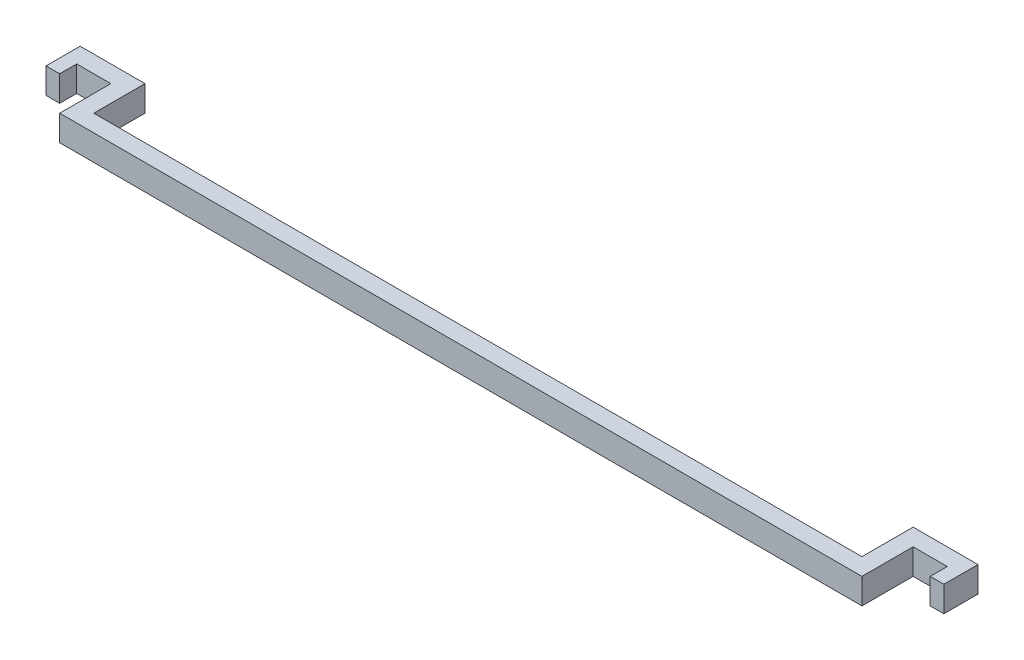
ISO-10303-21;
HEADER;
FILE_DESCRIPTION(('STEP AP214'),'2;1');
FILE_NAME('part.step','',(''),(''),'','','');
FILE_SCHEMA(('AUTOMOTIVE_DESIGN { 1 0 10303 214 1 1 1 1 }'));
ENDSEC;
DATA;
#1=APPLICATION_CONTEXT('core data for automotive mechanical design processes');
#2=APPLICATION_PROTOCOL_DEFINITION('international standard','automotive_design',2000,#1);
#3=PRODUCT_CONTEXT('',#1,'mechanical');
#4=PRODUCT('Part','Part','',(#3));
#5=PRODUCT_RELATED_PRODUCT_CATEGORY('part','',(#4));
#6=PRODUCT_DEFINITION_FORMATION('','',#4);
#7=PRODUCT_DEFINITION_CONTEXT('part definition',#1,'design');
#8=PRODUCT_DEFINITION('design','',#6,#7);
#9=PRODUCT_DEFINITION_SHAPE('','',#8);
#10=(LENGTH_UNIT() NAMED_UNIT(*) SI_UNIT(.MILLI.,.METRE.));
#11=(NAMED_UNIT(*) PLANE_ANGLE_UNIT() SI_UNIT($,.RADIAN.));
#12=(NAMED_UNIT(*) SI_UNIT($,.STERADIAN.) SOLID_ANGLE_UNIT());
#13=UNCERTAINTY_MEASURE_WITH_UNIT(LENGTH_MEASURE(1.E-05),#10,'distance_accuracy_value','');
#14=(GEOMETRIC_REPRESENTATION_CONTEXT(3) GLOBAL_UNCERTAINTY_ASSIGNED_CONTEXT((#13)) GLOBAL_UNIT_ASSIGNED_CONTEXT((#10,
#11,#12)) REPRESENTATION_CONTEXT('',''));
#15=CARTESIAN_POINT('',(0.,0.,0.));
#16=DIRECTION('',(0.,0.,1.));
#17=DIRECTION('',(1.,0.,0.));
#18=AXIS2_PLACEMENT_3D('',#15,#16,#17);
#19=CARTESIAN_POINT('',(0.,0.,0.));
#20=DIRECTION('',(0.,0.,-1.));
#21=DIRECTION('',(-1.,0.,0.));
#22=AXIS2_PLACEMENT_3D('',#19,#20,#21);
#23=PLANE('',#22);
#24=DIRECTION('',(0.,-1.,0.));
#25=VECTOR('',#24,1.);
#26=CARTESIAN_POINT('',(30.,15.0000000000001,0.));
#27=LINE('',#26,#25);
#28=CARTESIAN_POINT('',(30.,15.0000000000001,0.));
#29=VERTEX_POINT('',#28);
#30=CARTESIAN_POINT('',(30.,0.,0.));
#31=VERTEX_POINT('',#30);
#32=EDGE_CURVE('E174',#29,#31,#27,.T.);
#33=ORIENTED_EDGE('',*,*,#32,.T.);
#34=DIRECTION('',(1.,0.,0.));
#35=VECTOR('',#34,1.);
#36=CARTESIAN_POINT('',(0.,0.,0.));
#37=LINE('',#36,#35);
#38=CARTESIAN_POINT('',(-8.,0.,0.));
#39=VERTEX_POINT('',#38);
#40=EDGE_CURVE('E187',#39,#31,#37,.T.);
#41=ORIENTED_EDGE('',*,*,#40,.F.);
#42=DIRECTION('',(0.,-1.,0.));
#43=VECTOR('',#42,1.);
#44=CARTESIAN_POINT('',(-8.,15.,0.));
#45=LINE('',#44,#43);
#46=CARTESIAN_POINT('',(-8.,15.,0.));
#47=VERTEX_POINT('',#46);
#48=EDGE_CURVE('E185',#47,#39,#45,.T.);
#49=ORIENTED_EDGE('',*,*,#48,.F.);
#50=DIRECTION('',(-1.,0.,0.));
#51=VECTOR('',#50,1.);
#52=CARTESIAN_POINT('',(0.,15.,0.));
#53=LINE('',#52,#51);
#54=EDGE_CURVE('E164',#29,#47,#53,.T.);
#55=ORIENTED_EDGE('',*,*,#54,.F.);
#56=EDGE_LOOP('',(#33,#41,#49,#55));
#57=FACE_BOUND('',#56,.T.);
#58=ADVANCED_FACE('F47',(#57),#23,.T.);
#59=CARTESIAN_POINT('',(0.,0.,10.));
#60=DIRECTION('',(0.,0.,-1.));
#61=DIRECTION('',(-1.,0.,0.));
#62=AXIS2_PLACEMENT_3D('',#59,#60,#61);
#63=PLANE('',#62);
#64=DIRECTION('',(0.,-1.,0.));
#65=VECTOR('',#64,1.);
#66=CARTESIAN_POINT('',(490.,485.956473572665,10.));
#67=LINE('',#66,#65);
#68=CARTESIAN_POINT('',(490.,15.,10.));
#69=VERTEX_POINT('',#68);
#70=CARTESIAN_POINT('',(490.,0.,10.));
#71=VERTEX_POINT('',#70);
#72=EDGE_CURVE('E68',#69,#71,#67,.T.);
#73=ORIENTED_EDGE('',*,*,#72,.T.);
#74=DIRECTION('',(1.,0.,0.));
#75=VECTOR('',#74,1.);
#76=CARTESIAN_POINT('',(0.,0.,10.));
#77=LINE('',#76,#75);
#78=CARTESIAN_POINT('',(510.,0.,10.));
#79=VERTEX_POINT('',#78);
#80=EDGE_CURVE('E204',#71,#79,#77,.T.);
#81=ORIENTED_EDGE('',*,*,#80,.T.);
#82=DIRECTION('',(0.,1.,0.));
#83=VECTOR('',#82,1.);
#84=CARTESIAN_POINT('',(510.,0.,10.));
#85=LINE('',#84,#83);
#86=CARTESIAN_POINT('',(510.,15.,10.));
#87=VERTEX_POINT('',#86);
#88=EDGE_CURVE('E198',#79,#87,#85,.T.);
#89=ORIENTED_EDGE('',*,*,#88,.T.);
#90=DIRECTION('',(-1.,0.,0.));
#91=VECTOR('',#90,1.);
#92=CARTESIAN_POINT('',(0.,15.,10.));
#93=LINE('',#92,#91);
#94=EDGE_CURVE('E11',#87,#69,#93,.T.);
#95=ORIENTED_EDGE('',*,*,#94,.T.);
#96=EDGE_LOOP('',(#73,#81,#89,#95));
#97=FACE_BOUND('',#96,.T.);
#98=ADVANCED_FACE('F347',(#97),#63,.F.);
#99=CARTESIAN_POINT('',(0.,0.,10.));
#100=DIRECTION('',(0.,1.,0.));
#101=DIRECTION('',(0.,0.,1.));
#102=AXIS2_PLACEMENT_3D('',#99,#100,#101);
#103=PLANE('',#102);
#104=ORIENTED_EDGE('',*,*,#40,.T.);
#105=DIRECTION('',(0.,0.,1.));
#106=VECTOR('',#105,1.);
#107=CARTESIAN_POINT('',(30.,0.,0.));
#108=LINE('',#107,#106);
#109=CARTESIAN_POINT('',(30.,0.,30.));
#110=VERTEX_POINT('',#109);
#111=EDGE_CURVE('E177',#31,#110,#108,.T.);
#112=ORIENTED_EDGE('',*,*,#111,.T.);
#113=DIRECTION('',(1.,0.,0.));
#114=VECTOR('',#113,1.);
#115=CARTESIAN_POINT('',(0.,0.,30.));
#116=LINE('',#115,#114);
#117=CARTESIAN_POINT('',(480.,0.,30.));
#118=VERTEX_POINT('',#117);
#119=EDGE_CURVE('E297',#110,#118,#116,.T.);
#120=ORIENTED_EDGE('',*,*,#119,.T.);
#121=DIRECTION('',(0.,0.,-1.));
#122=VECTOR('',#121,1.);
#123=CARTESIAN_POINT('',(480.,0.,0.));
#124=LINE('',#123,#122);
#125=CARTESIAN_POINT('',(480.,0.,0.));
#126=VERTEX_POINT('',#125);
#127=EDGE_CURVE('E294',#118,#126,#124,.T.);
#128=ORIENTED_EDGE('',*,*,#127,.T.);
#129=CARTESIAN_POINT('',(518.,0.,0.));
#130=VERTEX_POINT('',#129);
#131=EDGE_CURVE('E192',#126,#130,#37,.T.);
#132=ORIENTED_EDGE('',*,*,#131,.T.);
#133=DIRECTION('',(0.,0.,1.));
#134=VECTOR('',#133,1.);
#135=CARTESIAN_POINT('',(518.,0.,0.));
#136=LINE('',#135,#134);
#137=CARTESIAN_POINT('',(518.,0.,20.));
#138=VERTEX_POINT('',#137);
#139=EDGE_CURVE('E211',#130,#138,#136,.T.);
#140=ORIENTED_EDGE('',*,*,#139,.T.);
#141=DIRECTION('',(1.,0.,0.));
#142=VECTOR('',#141,1.);
#143=CARTESIAN_POINT('',(510.,0.,20.));
#144=LINE('',#143,#142);
#145=CARTESIAN_POINT('',(510.,0.,20.));
#146=VERTEX_POINT('',#145);
#147=EDGE_CURVE('E231',#146,#138,#144,.T.);
#148=ORIENTED_EDGE('',*,*,#147,.F.);
#149=DIRECTION('',(0.,0.,1.));
#150=VECTOR('',#149,1.);
#151=CARTESIAN_POINT('',(510.,0.,0.));
#152=LINE('',#151,#150);
#153=EDGE_CURVE('E208',#79,#146,#152,.T.);
#154=ORIENTED_EDGE('',*,*,#153,.F.);
#155=ORIENTED_EDGE('',*,*,#80,.F.);
#156=DIRECTION('',(0.,0.,-1.));
#157=VECTOR('',#156,1.);
#158=CARTESIAN_POINT('',(490.,0.,0.));
#159=LINE('',#158,#157);
#160=CARTESIAN_POINT('',(490.,0.,40.0000000000001));
#161=VERTEX_POINT('',#160);
#162=EDGE_CURVE('E277',#161,#71,#159,.T.);
#163=ORIENTED_EDGE('',*,*,#162,.F.);
#164=DIRECTION('',(-1.,0.,0.));
#165=VECTOR('',#164,1.);
#166=CARTESIAN_POINT('',(0.,0.,40.));
#167=LINE('',#166,#165);
#168=CARTESIAN_POINT('',(20.,0.,40.));
#169=VERTEX_POINT('',#168);
#170=EDGE_CURVE('E307',#161,#169,#167,.T.);
#171=ORIENTED_EDGE('',*,*,#170,.T.);
#172=DIRECTION('',(0.,0.,-1.));
#173=VECTOR('',#172,1.);
#174=CARTESIAN_POINT('',(20.,0.,0.));
#175=LINE('',#174,#173);
#176=CARTESIAN_POINT('',(20.,0.,10.));
#177=VERTEX_POINT('',#176);
#178=EDGE_CURVE('E303',#169,#177,#175,.T.);
#179=ORIENTED_EDGE('',*,*,#178,.T.);
#180=CARTESIAN_POINT('',(0.,0.,10.));
#181=VERTEX_POINT('',#180);
#182=EDGE_CURVE('E201',#181,#177,#77,.T.);
#183=ORIENTED_EDGE('',*,*,#182,.F.);
#184=DIRECTION('',(0.,0.,1.));
#185=VECTOR('',#184,1.);
#186=CARTESIAN_POINT('',(0.,0.,0.));
#187=LINE('',#186,#185);
#188=CARTESIAN_POINT('',(0.,0.,20.));
#189=VERTEX_POINT('',#188);
#190=EDGE_CURVE('E258',#181,#189,#187,.T.);
#191=ORIENTED_EDGE('',*,*,#190,.T.);
#192=DIRECTION('',(1.,0.,0.));
#193=VECTOR('',#192,1.);
#194=CARTESIAN_POINT('',(0.,0.,20.));
#195=LINE('',#194,#193);
#196=CARTESIAN_POINT('',(-8.,0.,20.));
#197=VERTEX_POINT('',#196);
#198=EDGE_CURVE('E251',#197,#189,#195,.T.);
#199=ORIENTED_EDGE('',*,*,#198,.F.);
#200=DIRECTION('',(0.,0.,1.));
#201=VECTOR('',#200,1.);
#202=CARTESIAN_POINT('',(-8.,0.,0.));
#203=LINE('',#202,#201);
#204=EDGE_CURVE('E261',#39,#197,#203,.T.);
#205=ORIENTED_EDGE('',*,*,#204,.F.);
#206=EDGE_LOOP('',(#104,#112,#120,#128,#132,#140,#148,#154,#155,#163,#171,#179,#183,#191,#199,#205));
#207=FACE_BOUND('',#206,.T.);
#208=ADVANCED_FACE('F49',(#207),#103,.F.);
#209=CARTESIAN_POINT('',(0.,15.,10.));
#210=DIRECTION('',(0.,-1.,0.));
#211=DIRECTION('',(0.,0.,-1.));
#212=AXIS2_PLACEMENT_3D('',#209,#210,#211);
#213=PLANE('',#212);
#214=DIRECTION('',(0.,0.,-1.));
#215=VECTOR('',#214,1.);
#216=CARTESIAN_POINT('',(30.,15.,0.));
#217=LINE('',#216,#215);
#218=CARTESIAN_POINT('',(30.,15.,30.));
#219=VERTEX_POINT('',#218);
#220=EDGE_CURVE('E160',#219,#29,#217,.T.);
#221=ORIENTED_EDGE('',*,*,#220,.T.);
#222=ORIENTED_EDGE('',*,*,#54,.T.);
#223=DIRECTION('',(0.,0.,1.));
#224=VECTOR('',#223,1.);
#225=CARTESIAN_POINT('',(-8.,15.,0.));
#226=LINE('',#225,#224);
#227=CARTESIAN_POINT('',(-8.,15.,20.));
#228=VERTEX_POINT('',#227);
#229=EDGE_CURVE('E265',#47,#228,#226,.T.);
#230=ORIENTED_EDGE('',*,*,#229,.T.);
#231=DIRECTION('',(-1.,0.,0.));
#232=VECTOR('',#231,1.);
#233=CARTESIAN_POINT('',(0.,15.,20.));
#234=LINE('',#233,#232);
#235=CARTESIAN_POINT('',(0.,15.,20.));
#236=VERTEX_POINT('',#235);
#237=EDGE_CURVE('E243',#236,#228,#234,.T.);
#238=ORIENTED_EDGE('',*,*,#237,.F.);
#239=DIRECTION('',(0.,0.,1.));
#240=VECTOR('',#239,1.);
#241=CARTESIAN_POINT('',(0.,15.,0.));
#242=LINE('',#241,#240);
#243=CARTESIAN_POINT('',(0.,15.,10.));
#244=VERTEX_POINT('',#243);
#245=EDGE_CURVE('E257',#244,#236,#242,.T.);
#246=ORIENTED_EDGE('',*,*,#245,.F.);
#247=CARTESIAN_POINT('',(20.,15.0000000000001,10.));
#248=VERTEX_POINT('',#247);
#249=EDGE_CURVE('E57',#248,#244,#93,.T.);
#250=ORIENTED_EDGE('',*,*,#249,.F.);
#251=DIRECTION('',(0.,0.,1.));
#252=VECTOR('',#251,1.);
#253=CARTESIAN_POINT('',(20.,15.,0.));
#254=LINE('',#253,#252);
#255=CARTESIAN_POINT('',(20.,15.,40.));
#256=VERTEX_POINT('',#255);
#257=EDGE_CURVE('E262',#248,#256,#254,.T.);
#258=ORIENTED_EDGE('',*,*,#257,.T.);
#259=DIRECTION('',(1.,0.,0.));
#260=VECTOR('',#259,1.);
#261=CARTESIAN_POINT('',(0.,15.,40.));
#262=LINE('',#261,#260);
#263=CARTESIAN_POINT('',(490.,15.,40.0000000000001));
#264=VERTEX_POINT('',#263);
#265=EDGE_CURVE('E272',#256,#264,#262,.T.);
#266=ORIENTED_EDGE('',*,*,#265,.T.);
#267=DIRECTION('',(0.,0.,1.));
#268=VECTOR('',#267,1.);
#269=CARTESIAN_POINT('',(490.,15.,0.));
#270=LINE('',#269,#268);
#271=EDGE_CURVE('E313',#69,#264,#270,.T.);
#272=ORIENTED_EDGE('',*,*,#271,.F.);
#273=ORIENTED_EDGE('',*,*,#94,.F.);
#274=DIRECTION('',(0.,0.,1.));
#275=VECTOR('',#274,1.);
#276=CARTESIAN_POINT('',(510.,15.,0.));
#277=LINE('',#276,#275);
#278=CARTESIAN_POINT('',(510.,15.,20.));
#279=VERTEX_POINT('',#278);
#280=EDGE_CURVE('E196',#87,#279,#277,.T.);
#281=ORIENTED_EDGE('',*,*,#280,.T.);
#282=DIRECTION('',(-1.,0.,0.));
#283=VECTOR('',#282,1.);
#284=CARTESIAN_POINT('',(510.,15.,20.));
#285=LINE('',#284,#283);
#286=CARTESIAN_POINT('',(518.,15.,20.));
#287=VERTEX_POINT('',#286);
#288=EDGE_CURVE('E223',#287,#279,#285,.T.);
#289=ORIENTED_EDGE('',*,*,#288,.F.);
#290=DIRECTION('',(0.,0.,1.));
#291=VECTOR('',#290,1.);
#292=CARTESIAN_POINT('',(518.,15.,0.));
#293=LINE('',#292,#291);
#294=CARTESIAN_POINT('',(518.,15.,0.));
#295=VERTEX_POINT('',#294);
#296=EDGE_CURVE('E215',#295,#287,#293,.T.);
#297=ORIENTED_EDGE('',*,*,#296,.F.);
#298=CARTESIAN_POINT('',(480.,15.0000000000001,0.));
#299=VERTEX_POINT('',#298);
#300=EDGE_CURVE('E51',#295,#299,#53,.T.);
#301=ORIENTED_EDGE('',*,*,#300,.T.);
#302=DIRECTION('',(0.,0.,1.));
#303=VECTOR('',#302,1.);
#304=CARTESIAN_POINT('',(480.,15.,0.));
#305=LINE('',#304,#303);
#306=CARTESIAN_POINT('',(480.,15.,30.));
#307=VERTEX_POINT('',#306);
#308=EDGE_CURVE('E317',#299,#307,#305,.T.);
#309=ORIENTED_EDGE('',*,*,#308,.T.);
#310=DIRECTION('',(-1.,0.,0.));
#311=VECTOR('',#310,1.);
#312=CARTESIAN_POINT('',(0.,15.,30.));
#313=LINE('',#312,#311);
#314=EDGE_CURVE('E167',#307,#219,#313,.T.);
#315=ORIENTED_EDGE('',*,*,#314,.T.);
#316=EDGE_LOOP('',(#221,#222,#230,#238,#246,#250,#258,#266,#272,#273,#281,#289,#297,#301,#309,#315));
#317=FACE_BOUND('',#316,.T.);
#318=ADVANCED_FACE('F162',(#317),#213,.F.);
#319=ORIENTED_EDGE('',*,*,#182,.T.);
#320=DIRECTION('',(0.,-1.,0.));
#321=VECTOR('',#320,1.);
#322=CARTESIAN_POINT('',(20.,485.956473572665,10.));
#323=LINE('',#322,#321);
#324=EDGE_CURVE('E276',#248,#177,#323,.T.);
#325=ORIENTED_EDGE('',*,*,#324,.F.);
#326=ORIENTED_EDGE('',*,*,#249,.T.);
#327=DIRECTION('',(0.,-1.,0.));
#328=VECTOR('',#327,1.);
#329=CARTESIAN_POINT('',(0.,0.,10.));
#330=LINE('',#329,#328);
#331=EDGE_CURVE('E191',#244,#181,#330,.T.);
#332=ORIENTED_EDGE('',*,*,#331,.T.);
#333=EDGE_LOOP('',(#319,#325,#326,#332));
#334=FACE_BOUND('',#333,.T.);
#335=ADVANCED_FACE('F354',(#334),#63,.F.);
#336=DIRECTION('',(0.,-1.,0.));
#337=VECTOR('',#336,1.);
#338=CARTESIAN_POINT('',(480.,15.0000000000001,0.));
#339=LINE('',#338,#337);
#340=EDGE_CURVE('E181',#299,#126,#339,.T.);
#341=ORIENTED_EDGE('',*,*,#340,.F.);
#342=ORIENTED_EDGE('',*,*,#300,.F.);
#343=DIRECTION('',(0.,1.,0.));
#344=VECTOR('',#343,1.);
#345=CARTESIAN_POINT('',(518.,15.,0.));
#346=LINE('',#345,#344);
#347=EDGE_CURVE('E212',#130,#295,#346,.T.);
#348=ORIENTED_EDGE('',*,*,#347,.F.);
#349=ORIENTED_EDGE('',*,*,#131,.F.);
#350=EDGE_LOOP('',(#341,#342,#348,#349));
#351=FACE_BOUND('',#350,.T.);
#352=ADVANCED_FACE('F332',(#351),#23,.T.);
#353=CARTESIAN_POINT('',(510.,15.,0.));
#354=DIRECTION('',(-1.,0.,0.));
#355=DIRECTION('',(0.,0.,1.));
#356=AXIS2_PLACEMENT_3D('',#353,#354,#355);
#357=PLANE('',#356);
#358=ORIENTED_EDGE('',*,*,#88,.F.);
#359=ORIENTED_EDGE('',*,*,#153,.T.);
#360=DIRECTION('',(0.,-1.,0.));
#361=VECTOR('',#360,1.);
#362=CARTESIAN_POINT('',(510.,15.,20.));
#363=LINE('',#362,#361);
#364=EDGE_CURVE('E235',#279,#146,#363,.T.);
#365=ORIENTED_EDGE('',*,*,#364,.F.);
#366=ORIENTED_EDGE('',*,*,#280,.F.);
#367=EDGE_LOOP('',(#358,#359,#365,#366));
#368=FACE_BOUND('',#367,.T.);
#369=ADVANCED_FACE('F345',(#368),#357,.T.);
#370=CARTESIAN_POINT('',(518.,15.,0.));
#371=DIRECTION('',(1.,0.,0.));
#372=DIRECTION('',(0.,0.,-1.));
#373=AXIS2_PLACEMENT_3D('',#370,#371,#372);
#374=PLANE('',#373);
#375=ORIENTED_EDGE('',*,*,#296,.T.);
#376=DIRECTION('',(0.,1.,0.));
#377=VECTOR('',#376,1.);
#378=CARTESIAN_POINT('',(518.,15.,20.));
#379=LINE('',#378,#377);
#380=EDGE_CURVE('E227',#138,#287,#379,.T.);
#381=ORIENTED_EDGE('',*,*,#380,.F.);
#382=ORIENTED_EDGE('',*,*,#139,.F.);
#383=ORIENTED_EDGE('',*,*,#347,.T.);
#384=EDGE_LOOP('',(#375,#381,#382,#383));
#385=FACE_BOUND('',#384,.T.);
#386=ADVANCED_FACE('F337',(#385),#374,.T.);
#387=CARTESIAN_POINT('',(0.,0.,20.));
#388=DIRECTION('',(0.,0.,1.));
#389=DIRECTION('',(1.,0.,0.));
#390=AXIS2_PLACEMENT_3D('',#387,#388,#389);
#391=PLANE('',#390);
#392=ORIENTED_EDGE('',*,*,#364,.T.);
#393=ORIENTED_EDGE('',*,*,#147,.T.);
#394=ORIENTED_EDGE('',*,*,#380,.T.);
#395=ORIENTED_EDGE('',*,*,#288,.T.);
#396=EDGE_LOOP('',(#392,#393,#394,#395));
#397=FACE_BOUND('',#396,.T.);
#398=ADVANCED_FACE('F341',(#397),#391,.T.);
#399=CARTESIAN_POINT('',(0.,15.,0.));
#400=DIRECTION('',(1.,0.,0.));
#401=DIRECTION('',(0.,0.,-1.));
#402=AXIS2_PLACEMENT_3D('',#399,#400,#401);
#403=PLANE('',#402);
#404=ORIENTED_EDGE('',*,*,#331,.F.);
#405=ORIENTED_EDGE('',*,*,#245,.T.);
#406=DIRECTION('',(0.,1.,0.));
#407=VECTOR('',#406,1.);
#408=CARTESIAN_POINT('',(0.,15.,20.));
#409=LINE('',#408,#407);
#410=EDGE_CURVE('E239',#189,#236,#409,.T.);
#411=ORIENTED_EDGE('',*,*,#410,.F.);
#412=ORIENTED_EDGE('',*,*,#190,.F.);
#413=EDGE_LOOP('',(#404,#405,#411,#412));
#414=FACE_BOUND('',#413,.T.);
#415=ADVANCED_FACE('F358',(#414),#403,.T.);
#416=CARTESIAN_POINT('',(-8.,15.,0.));
#417=DIRECTION('',(-1.,0.,0.));
#418=DIRECTION('',(0.,-1.,0.));
#419=AXIS2_PLACEMENT_3D('',#416,#417,#418);
#420=PLANE('',#419);
#421=ORIENTED_EDGE('',*,*,#204,.T.);
#422=DIRECTION('',(0.,-1.,0.));
#423=VECTOR('',#422,1.);
#424=CARTESIAN_POINT('',(-8.,15.,20.));
#425=LINE('',#424,#423);
#426=EDGE_CURVE('E247',#228,#197,#425,.T.);
#427=ORIENTED_EDGE('',*,*,#426,.F.);
#428=ORIENTED_EDGE('',*,*,#229,.F.);
#429=ORIENTED_EDGE('',*,*,#48,.T.);
#430=EDGE_LOOP('',(#421,#427,#428,#429));
#431=FACE_BOUND('',#430,.T.);
#432=ADVANCED_FACE('F411',(#431),#420,.T.);
#433=CARTESIAN_POINT('',(0.,0.,20.));
#434=DIRECTION('',(0.,0.,-1.));
#435=DIRECTION('',(-1.,0.,0.));
#436=AXIS2_PLACEMENT_3D('',#433,#434,#435);
#437=PLANE('',#436);
#438=ORIENTED_EDGE('',*,*,#410,.T.);
#439=ORIENTED_EDGE('',*,*,#237,.T.);
#440=ORIENTED_EDGE('',*,*,#426,.T.);
#441=ORIENTED_EDGE('',*,*,#198,.T.);
#442=EDGE_LOOP('',(#438,#439,#440,#441));
#443=FACE_BOUND('',#442,.T.);
#444=ADVANCED_FACE('F364',(#443),#437,.F.);
#445=CARTESIAN_POINT('',(0.,485.956473572665,40.));
#446=DIRECTION('',(0.,0.,1.));
#447=DIRECTION('',(1.,0.,0.));
#448=AXIS2_PLACEMENT_3D('',#445,#446,#447);
#449=PLANE('',#448);
#450=ORIENTED_EDGE('',*,*,#265,.F.);
#451=DIRECTION('',(0.,-1.,0.));
#452=VECTOR('',#451,1.);
#453=CARTESIAN_POINT('',(20.,485.956473572665,40.));
#454=LINE('',#453,#452);
#455=EDGE_CURVE('E273',#256,#169,#454,.T.);
#456=ORIENTED_EDGE('',*,*,#455,.T.);
#457=ORIENTED_EDGE('',*,*,#170,.F.);
#458=DIRECTION('',(0.,-1.,0.));
#459=VECTOR('',#458,1.);
#460=CARTESIAN_POINT('',(490.,485.956473572665,40.0000000000001));
#461=LINE('',#460,#459);
#462=EDGE_CURVE('E171',#264,#161,#461,.T.);
#463=ORIENTED_EDGE('',*,*,#462,.F.);
#464=EDGE_LOOP('',(#450,#456,#457,#463));
#465=FACE_BOUND('',#464,.T.);
#466=ADVANCED_FACE('F373',(#465),#449,.T.);
#467=CARTESIAN_POINT('',(490.,485.956473572665,0.));
#468=DIRECTION('',(-1.,0.,0.));
#469=DIRECTION('',(0.,0.,1.));
#470=AXIS2_PLACEMENT_3D('',#467,#468,#469);
#471=PLANE('',#470);
#472=ORIENTED_EDGE('',*,*,#72,.F.);
#473=ORIENTED_EDGE('',*,*,#271,.T.);
#474=ORIENTED_EDGE('',*,*,#462,.T.);
#475=ORIENTED_EDGE('',*,*,#162,.T.);
#476=EDGE_LOOP('',(#472,#473,#474,#475));
#477=FACE_BOUND('',#476,.T.);
#478=ADVANCED_FACE('F376',(#477),#471,.F.);
#479=CARTESIAN_POINT('',(480.,485.956473572665,0.));
#480=DIRECTION('',(-1.,0.,0.));
#481=DIRECTION('',(0.,0.,1.));
#482=AXIS2_PLACEMENT_3D('',#479,#480,#481);
#483=PLANE('',#482);
#484=ORIENTED_EDGE('',*,*,#308,.F.);
#485=ORIENTED_EDGE('',*,*,#340,.T.);
#486=ORIENTED_EDGE('',*,*,#127,.F.);
#487=DIRECTION('',(0.,-1.,0.));
#488=VECTOR('',#487,1.);
#489=CARTESIAN_POINT('',(480.,485.956473572665,30.));
#490=LINE('',#489,#488);
#491=EDGE_CURVE('E284',#307,#118,#490,.T.);
#492=ORIENTED_EDGE('',*,*,#491,.F.);
#493=EDGE_LOOP('',(#484,#485,#486,#492));
#494=FACE_BOUND('',#493,.T.);
#495=ADVANCED_FACE('F328',(#494),#483,.T.);
#496=CARTESIAN_POINT('',(0.,485.956473572665,30.));
#497=DIRECTION('',(0.,0.,-1.));
#498=DIRECTION('',(-1.,0.,0.));
#499=AXIS2_PLACEMENT_3D('',#496,#497,#498);
#500=PLANE('',#499);
#501=ORIENTED_EDGE('',*,*,#314,.F.);
#502=ORIENTED_EDGE('',*,*,#491,.T.);
#503=ORIENTED_EDGE('',*,*,#119,.F.);
#504=DIRECTION('',(0.,-1.,0.));
#505=VECTOR('',#504,1.);
#506=CARTESIAN_POINT('',(30.,485.956473572665,30.));
#507=LINE('',#506,#505);
#508=EDGE_CURVE('E281',#219,#110,#507,.T.);
#509=ORIENTED_EDGE('',*,*,#508,.F.);
#510=EDGE_LOOP('',(#501,#502,#503,#509));
#511=FACE_BOUND('',#510,.T.);
#512=ADVANCED_FACE('F384',(#511),#500,.T.);
#513=CARTESIAN_POINT('',(30.,485.956473572665,0.));
#514=DIRECTION('',(1.,0.,0.));
#515=DIRECTION('',(0.,0.,-1.));
#516=AXIS2_PLACEMENT_3D('',#513,#514,#515);
#517=PLANE('',#516);
#518=ORIENTED_EDGE('',*,*,#220,.F.);
#519=ORIENTED_EDGE('',*,*,#508,.T.);
#520=ORIENTED_EDGE('',*,*,#111,.F.);
#521=ORIENTED_EDGE('',*,*,#32,.F.);
#522=EDGE_LOOP('',(#518,#519,#520,#521));
#523=FACE_BOUND('',#522,.T.);
#524=ADVANCED_FACE('F175',(#523),#517,.T.);
#525=CARTESIAN_POINT('',(20.,485.956473572665,0.));
#526=DIRECTION('',(-1.,0.,0.));
#527=DIRECTION('',(0.,0.,1.));
#528=AXIS2_PLACEMENT_3D('',#525,#526,#527);
#529=PLANE('',#528);
#530=ORIENTED_EDGE('',*,*,#257,.F.);
#531=ORIENTED_EDGE('',*,*,#324,.T.);
#532=ORIENTED_EDGE('',*,*,#178,.F.);
#533=ORIENTED_EDGE('',*,*,#455,.F.);
#534=EDGE_LOOP('',(#530,#531,#532,#533));
#535=FACE_BOUND('',#534,.T.);
#536=ADVANCED_FACE('F368',(#535),#529,.T.);
#537=CLOSED_SHELL('',(#58,#98,#208,#318,#335,#352,#369,#386,#398,#415,#432,#444,#466,#478,#495,
#512,#524,#536));
#538=MANIFOLD_SOLID_BREP('B2',#537);
#539=ADVANCED_BREP_SHAPE_REPRESENTATION('',(#18,#538),#14);
#540=SHAPE_DEFINITION_REPRESENTATION(#9,#539);
ENDSEC;
END-ISO-10303-21;
